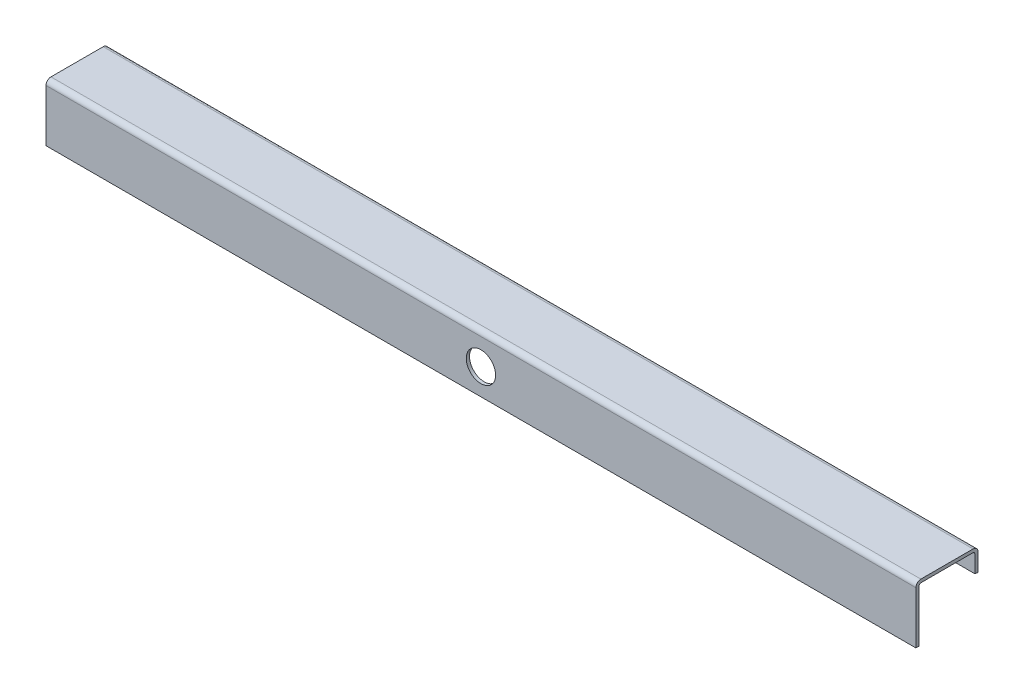
ISO-10303-21;
HEADER;
FILE_DESCRIPTION(('STEP AP214'),'2;1');
FILE_NAME('part.step','',(''),(''),'','','');
FILE_SCHEMA(('AUTOMOTIVE_DESIGN { 1 0 10303 214 1 1 1 1 }'));
ENDSEC;
DATA;
#1=APPLICATION_CONTEXT('core data for automotive mechanical design processes');
#2=APPLICATION_PROTOCOL_DEFINITION('international standard','automotive_design',2000,#1);
#3=PRODUCT_CONTEXT('',#1,'mechanical');
#4=PRODUCT('Part','Part','',(#3));
#5=PRODUCT_RELATED_PRODUCT_CATEGORY('part','',(#4));
#6=PRODUCT_DEFINITION_FORMATION('','',#4);
#7=PRODUCT_DEFINITION_CONTEXT('part definition',#1,'design');
#8=PRODUCT_DEFINITION('design','',#6,#7);
#9=PRODUCT_DEFINITION_SHAPE('','',#8);
#10=(LENGTH_UNIT() NAMED_UNIT(*) SI_UNIT(.MILLI.,.METRE.));
#11=(NAMED_UNIT(*) PLANE_ANGLE_UNIT() SI_UNIT($,.RADIAN.));
#12=(NAMED_UNIT(*) SI_UNIT($,.STERADIAN.) SOLID_ANGLE_UNIT());
#13=UNCERTAINTY_MEASURE_WITH_UNIT(LENGTH_MEASURE(1.E-05),#10,'distance_accuracy_value','');
#14=(GEOMETRIC_REPRESENTATION_CONTEXT(3) GLOBAL_UNCERTAINTY_ASSIGNED_CONTEXT((#13)) GLOBAL_UNIT_ASSIGNED_CONTEXT((#10,
#11,#12)) REPRESENTATION_CONTEXT('',''));
#15=CARTESIAN_POINT('',(0.,0.,0.));
#16=DIRECTION('',(0.,0.,1.));
#17=DIRECTION('',(1.,0.,0.));
#18=AXIS2_PLACEMENT_3D('',#15,#16,#17);
#19=CARTESIAN_POINT('',(177.8,22.6100351903886,12.5324354084501));
#20=DIRECTION('',(0.,0.978147600733808,-0.207911690817749));
#21=DIRECTION('',(0.,0.207911690817749,0.978147600733808));
#22=AXIS2_PLACEMENT_3D('',#19,#20,#21);
#23=PLANE('',#22);
#24=DIRECTION('',(-1.,0.,0.));
#25=VECTOR('',#24,1.);
#26=CARTESIAN_POINT('',(177.8,22.6100351903886,12.5324354084501));
#27=LINE('',#26,#25);
#28=CARTESIAN_POINT('',(177.8,22.6100351903886,12.5324354084501));
#29=VERTEX_POINT('',#28);
#30=CARTESIAN_POINT('',(91.3118069619053,22.6100351903886,12.5324354084501));
#31=VERTEX_POINT('',#30);
#32=EDGE_CURVE('E159',#29,#31,#27,.T.);
#33=ORIENTED_EDGE('',*,*,#32,.T.);
#34=CARTESIAN_POINT('',(88.9,20.8258863237003,4.13867493043614));
#35=DIRECTION('',(0.,0.978147600733808,-0.207911690817749));
#36=DIRECTION('',(0.,0.207911690817749,0.978147600733808));
#37=AXIS2_PLACEMENT_3D('',#34,#35,#36);
#38=ELLIPSE('',#37,14.4292030342332,3.00000000000001);
#39=CARTESIAN_POINT('',(91.4095813942013,22.4696628370617,11.8720354084501));
#40=VERTEX_POINT('',#39);
#41=EDGE_CURVE('E62',#31,#40,#38,.T.);
#42=ORIENTED_EDGE('',*,*,#41,.T.);
#43=DIRECTION('',(-1.,0.,0.));
#44=VECTOR('',#43,1.);
#45=CARTESIAN_POINT('',(177.8,22.4696628370617,11.8720354084501));
#46=LINE('',#45,#44);
#47=CARTESIAN_POINT('',(177.8,22.4696628370617,11.8720354084501));
#48=VERTEX_POINT('',#47);
#49=EDGE_CURVE('E55',#48,#40,#46,.T.);
#50=ORIENTED_EDGE('',*,*,#49,.F.);
#51=DIRECTION('',(0.,-0.207911690817749,-0.978147600733808));
#52=VECTOR('',#51,1.);
#53=CARTESIAN_POINT('',(177.8,22.6100351903886,12.5324354084501));
#54=LINE('',#53,#52);
#55=EDGE_CURVE('E172',#29,#48,#54,.T.);
#56=ORIENTED_EDGE('',*,*,#55,.F.);
#57=EDGE_LOOP('',(#33,#42,#50,#56));
#58=FACE_BOUND('',#57,.T.);
#59=ADVANCED_FACE('F47',(#58),#23,.F.);
#60=CARTESIAN_POINT('',(86.3904186057987,22.4696628370617,11.8720354084501));
#61=VERTEX_POINT('',#60);
#62=CARTESIAN_POINT('',(0.,22.4696628370617,11.8720354084501));
#63=VERTEX_POINT('',#62);
#64=EDGE_CURVE('E165',#61,#63,#46,.T.);
#65=ORIENTED_EDGE('',*,*,#64,.F.);
#66=CARTESIAN_POINT('',(86.4881930380947,22.6100351903886,12.5324354084501));
#67=VERTEX_POINT('',#66);
#68=EDGE_CURVE('E149',#61,#67,#38,.T.);
#69=ORIENTED_EDGE('',*,*,#68,.T.);
#70=CARTESIAN_POINT('',(0.,22.6100351903886,12.5324354084501));
#71=VERTEX_POINT('',#70);
#72=EDGE_CURVE('E177',#67,#71,#27,.T.);
#73=ORIENTED_EDGE('',*,*,#72,.T.);
#74=DIRECTION('',(0.,-0.207911690817749,-0.978147600733808));
#75=VECTOR('',#74,1.);
#76=CARTESIAN_POINT('',(0.,22.6100351903886,12.5324354084501));
#77=LINE('',#76,#75);
#78=EDGE_CURVE('E170',#71,#63,#77,.T.);
#79=ORIENTED_EDGE('',*,*,#78,.T.);
#80=EDGE_LOOP('',(#65,#69,#73,#79));
#81=FACE_BOUND('',#80,.T.);
#82=ADVANCED_FACE('F249',(#81),#23,.F.);
#83=CARTESIAN_POINT('',(177.8,22.4696628370617,11.8720354084501));
#84=DIRECTION('',(0.,0.,1.));
#85=DIRECTION('',(1.,0.,0.));
#86=AXIS2_PLACEMENT_3D('',#83,#84,#85);
#87=PLANE('',#86);
#88=ORIENTED_EDGE('',*,*,#49,.T.);
#89=CARTESIAN_POINT('',(88.9,20.8258863237003,11.8720354084501));
#90=DIRECTION('',(0.,0.,1.));
#91=DIRECTION('',(1.,0.,0.));
#92=AXIS2_PLACEMENT_3D('',#89,#90,#91);
#93=CIRCLE('',#92,3.00000000000001);
#94=EDGE_CURVE('E146',#40,#61,#93,.T.);
#95=ORIENTED_EDGE('',*,*,#94,.T.);
#96=ORIENTED_EDGE('',*,*,#64,.T.);
#97=DIRECTION('',(0.,1.,0.));
#98=VECTOR('',#97,1.);
#99=CARTESIAN_POINT('',(0.,22.4696628370617,11.8720354084501));
#100=LINE('',#99,#98);
#101=CARTESIAN_POINT('',(0.,26.1598863237003,11.8720354084501));
#102=VERTEX_POINT('',#101);
#103=EDGE_CURVE('E178',#63,#102,#100,.T.);
#104=ORIENTED_EDGE('',*,*,#103,.T.);
#105=DIRECTION('',(-1.,0.,0.));
#106=VECTOR('',#105,1.);
#107=CARTESIAN_POINT('',(177.8,26.1598863237003,11.8720354084501));
#108=LINE('',#107,#106);
#109=CARTESIAN_POINT('',(177.8,26.1598863237003,11.8720354084501));
#110=VERTEX_POINT('',#109);
#111=EDGE_CURVE('E167',#110,#102,#108,.T.);
#112=ORIENTED_EDGE('',*,*,#111,.F.);
#113=DIRECTION('',(0.,1.,0.));
#114=VECTOR('',#113,1.);
#115=CARTESIAN_POINT('',(177.8,22.4696628370617,11.8720354084501));
#116=LINE('',#115,#114);
#117=EDGE_CURVE('E164',#48,#110,#116,.T.);
#118=ORIENTED_EDGE('',*,*,#117,.F.);
#119=EDGE_LOOP('',(#88,#95,#96,#104,#112,#118));
#120=FACE_BOUND('',#119,.T.);
#121=ADVANCED_FACE('F162',(#120),#87,.F.);
#122=CARTESIAN_POINT('',(177.8,26.1598863237003,12.8880354084501));
#123=DIRECTION('',(-1.,0.,0.));
#124=DIRECTION('',(0.,0.,1.));
#125=AXIS2_PLACEMENT_3D('',#122,#123,#124);
#126=CYLINDRICAL_SURFACE('',#125,1.016);
#127=CARTESIAN_POINT('',(0.,26.1598863237003,12.8880354084501));
#128=DIRECTION('',(1.,0.,0.));
#129=DIRECTION('',(0.,0.,-1.));
#130=AXIS2_PLACEMENT_3D('',#127,#128,#129);
#131=CIRCLE('',#130,1.016);
#132=CARTESIAN_POINT('',(0.,27.1758863237003,12.8880354084501));
#133=VERTEX_POINT('',#132);
#134=EDGE_CURVE('E180',#102,#133,#131,.T.);
#135=ORIENTED_EDGE('',*,*,#134,.T.);
#136=DIRECTION('',(-1.,0.,0.));
#137=VECTOR('',#136,1.);
#138=CARTESIAN_POINT('',(177.8,27.1758863237003,12.8880354084501));
#139=LINE('',#138,#137);
#140=CARTESIAN_POINT('',(177.8,27.1758863237003,12.8880354084501));
#141=VERTEX_POINT('',#140);
#142=EDGE_CURVE('E183',#141,#133,#139,.T.);
#143=ORIENTED_EDGE('',*,*,#142,.F.);
#144=CARTESIAN_POINT('',(177.8,26.1598863237003,12.8880354084501));
#145=DIRECTION('',(1.,0.,0.));
#146=DIRECTION('',(0.,0.,-1.));
#147=AXIS2_PLACEMENT_3D('',#144,#145,#146);
#148=CIRCLE('',#147,1.016);
#149=EDGE_CURVE('E185',#110,#141,#148,.T.);
#150=ORIENTED_EDGE('',*,*,#149,.F.);
#151=ORIENTED_EDGE('',*,*,#111,.T.);
#152=EDGE_LOOP('',(#135,#143,#150,#151));
#153=FACE_BOUND('',#152,.T.);
#154=ADVANCED_FACE('F308',(#153),#126,.T.);
#155=CARTESIAN_POINT('',(177.8,27.1758863237003,12.8880354084501));
#156=DIRECTION('',(0.,-1.,0.));
#157=DIRECTION('',(0.,0.,-1.));
#158=AXIS2_PLACEMENT_3D('',#155,#156,#157);
#159=PLANE('',#158);
#160=DIRECTION('',(0.,0.,1.));
#161=VECTOR('',#160,1.);
#162=CARTESIAN_POINT('',(0.,27.1758863237003,12.8880354084501));
#163=LINE('',#162,#161);
#164=CARTESIAN_POINT('',(0.,27.1758863237003,23.5560354084501));
#165=VERTEX_POINT('',#164);
#166=EDGE_CURVE('E187',#133,#165,#163,.T.);
#167=ORIENTED_EDGE('',*,*,#166,.T.);
#168=DIRECTION('',(-1.,0.,0.));
#169=VECTOR('',#168,1.);
#170=CARTESIAN_POINT('',(177.8,27.1758863237003,23.5560354084501));
#171=LINE('',#170,#169);
#172=CARTESIAN_POINT('',(177.8,27.1758863237003,23.5560354084501));
#173=VERTEX_POINT('',#172);
#174=EDGE_CURVE('E190',#173,#165,#171,.T.);
#175=ORIENTED_EDGE('',*,*,#174,.F.);
#176=DIRECTION('',(0.,0.,1.));
#177=VECTOR('',#176,1.);
#178=CARTESIAN_POINT('',(177.8,27.1758863237003,12.8880354084501));
#179=LINE('',#178,#177);
#180=EDGE_CURVE('E192',#141,#173,#179,.T.);
#181=ORIENTED_EDGE('',*,*,#180,.F.);
#182=ORIENTED_EDGE('',*,*,#142,.T.);
#183=EDGE_LOOP('',(#167,#175,#181,#182));
#184=FACE_BOUND('',#183,.T.);
#185=ADVANCED_FACE('F304',(#184),#159,.F.);
#186=CARTESIAN_POINT('',(177.8,26.1598863237003,23.5560354084501));
#187=DIRECTION('',(-1.,0.,0.));
#188=DIRECTION('',(0.,0.,1.));
#189=AXIS2_PLACEMENT_3D('',#186,#187,#188);
#190=CYLINDRICAL_SURFACE('',#189,1.016);
#191=CARTESIAN_POINT('',(0.,26.1598863237003,23.5560354084501));
#192=DIRECTION('',(1.,0.,0.));
#193=DIRECTION('',(0.,0.,-1.));
#194=AXIS2_PLACEMENT_3D('',#191,#192,#193);
#195=CIRCLE('',#194,1.01599999999999);
#196=CARTESIAN_POINT('',(0.,26.1598863237003,24.5720354084501));
#197=VERTEX_POINT('',#196);
#198=EDGE_CURVE('E194',#165,#197,#195,.T.);
#199=ORIENTED_EDGE('',*,*,#198,.T.);
#200=DIRECTION('',(-1.,0.,0.));
#201=VECTOR('',#200,1.);
#202=CARTESIAN_POINT('',(177.8,26.1598863237003,24.5720354084501));
#203=LINE('',#202,#201);
#204=CARTESIAN_POINT('',(177.8,26.1598863237003,24.5720354084501));
#205=VERTEX_POINT('',#204);
#206=EDGE_CURVE('E197',#205,#197,#203,.T.);
#207=ORIENTED_EDGE('',*,*,#206,.F.);
#208=CARTESIAN_POINT('',(177.8,26.1598863237003,23.5560354084501));
#209=DIRECTION('',(1.,0.,0.));
#210=DIRECTION('',(0.,0.,-1.));
#211=AXIS2_PLACEMENT_3D('',#208,#209,#210);
#212=CIRCLE('',#211,1.01599999999999);
#213=EDGE_CURVE('E199',#173,#205,#212,.T.);
#214=ORIENTED_EDGE('',*,*,#213,.F.);
#215=ORIENTED_EDGE('',*,*,#174,.T.);
#216=EDGE_LOOP('',(#199,#207,#214,#215));
#217=FACE_BOUND('',#216,.T.);
#218=ADVANCED_FACE('F273',(#217),#190,.T.);
#219=CARTESIAN_POINT('',(177.8,26.1598863237003,24.5720354084501));
#220=DIRECTION('',(0.,0.,-1.));
#221=DIRECTION('',(0.,1.,0.));
#222=AXIS2_PLACEMENT_3D('',#219,#220,#221);
#223=PLANE('',#222);
#224=CARTESIAN_POINT('',(88.9,20.8258863237003,24.5720354084501));
#225=DIRECTION('',(0.,0.,1.));
#226=DIRECTION('',(1.,0.,0.));
#227=AXIS2_PLACEMENT_3D('',#224,#225,#226);
#228=CIRCLE('',#227,3.00000000000001);
#229=CARTESIAN_POINT('',(91.9,20.8258863237003,24.5720354084501));
#230=VERTEX_POINT('',#229);
#231=EDGE_CURVE('E153',#230,#230,#228,.T.);
#232=ORIENTED_EDGE('',*,*,#231,.F.);
#233=EDGE_LOOP('',(#232));
#234=FACE_BOUND('',#233,.T.);
#235=DIRECTION('',(0.,-1.,0.));
#236=VECTOR('',#235,1.);
#237=CARTESIAN_POINT('',(0.,26.1598863237003,24.5720354084501));
#238=LINE('',#237,#236);
#239=CARTESIAN_POINT('',(0.,15.4918863237003,24.5720354084501));
#240=VERTEX_POINT('',#239);
#241=EDGE_CURVE('E201',#197,#240,#238,.T.);
#242=ORIENTED_EDGE('',*,*,#241,.T.);
#243=DIRECTION('',(-1.,0.,0.));
#244=VECTOR('',#243,1.);
#245=CARTESIAN_POINT('',(177.8,15.4918863237003,24.5720354084501));
#246=LINE('',#245,#244);
#247=CARTESIAN_POINT('',(177.8,15.4918863237003,24.5720354084501));
#248=VERTEX_POINT('',#247);
#249=EDGE_CURVE('E204',#248,#240,#246,.T.);
#250=ORIENTED_EDGE('',*,*,#249,.F.);
#251=DIRECTION('',(0.,-1.,0.));
#252=VECTOR('',#251,1.);
#253=CARTESIAN_POINT('',(177.8,26.1598863237003,24.5720354084501));
#254=LINE('',#253,#252);
#255=EDGE_CURVE('E206',#205,#248,#254,.T.);
#256=ORIENTED_EDGE('',*,*,#255,.F.);
#257=ORIENTED_EDGE('',*,*,#206,.T.);
#258=EDGE_LOOP('',(#242,#250,#256,#257));
#259=FACE_BOUND('',#258,.T.);
#260=ADVANCED_FACE('F269',(#234,#259),#223,.F.);
#261=CARTESIAN_POINT('',(177.8,15.4918863237003,24.5720354084501));
#262=DIRECTION('',(0.,1.,0.));
#263=DIRECTION('',(0.,0.,1.));
#264=AXIS2_PLACEMENT_3D('',#261,#262,#263);
#265=PLANE('',#264);
#266=DIRECTION('',(0.,0.,-1.));
#267=VECTOR('',#266,1.);
#268=CARTESIAN_POINT('',(0.,15.4918863237003,24.5720354084501));
#269=LINE('',#268,#267);
#270=CARTESIAN_POINT('',(0.,15.4918863237003,23.9116354084501));
#271=VERTEX_POINT('',#270);
#272=EDGE_CURVE('E208',#240,#271,#269,.T.);
#273=ORIENTED_EDGE('',*,*,#272,.T.);
#274=DIRECTION('',(-1.,0.,0.));
#275=VECTOR('',#274,1.);
#276=CARTESIAN_POINT('',(177.8,15.4918863237003,23.9116354084501));
#277=LINE('',#276,#275);
#278=CARTESIAN_POINT('',(177.8,15.4918863237003,23.9116354084501));
#279=VERTEX_POINT('',#278);
#280=EDGE_CURVE('E211',#279,#271,#277,.T.);
#281=ORIENTED_EDGE('',*,*,#280,.F.);
#282=DIRECTION('',(0.,0.,-1.));
#283=VECTOR('',#282,1.);
#284=CARTESIAN_POINT('',(177.8,15.4918863237003,24.5720354084501));
#285=LINE('',#284,#283);
#286=EDGE_CURVE('E213',#248,#279,#285,.T.);
#287=ORIENTED_EDGE('',*,*,#286,.F.);
#288=ORIENTED_EDGE('',*,*,#249,.T.);
#289=EDGE_LOOP('',(#273,#281,#287,#288));
#290=FACE_BOUND('',#289,.T.);
#291=ADVANCED_FACE('F272',(#290),#265,.F.);
#292=CARTESIAN_POINT('',(177.8,26.1598863237003,23.9116354084501));
#293=DIRECTION('',(0.,0.,1.));
#294=DIRECTION('',(1.,0.,0.));
#295=AXIS2_PLACEMENT_3D('',#292,#293,#294);
#296=PLANE('',#295);
#297=CARTESIAN_POINT('',(88.9,20.8258863237003,23.9116354084501));
#298=DIRECTION('',(0.,0.,1.));
#299=DIRECTION('',(1.,0.,0.));
#300=AXIS2_PLACEMENT_3D('',#297,#298,#299);
#301=CIRCLE('',#300,3.00000000000001);
#302=CARTESIAN_POINT('',(91.9,20.8258863237003,23.9116354084501));
#303=VERTEX_POINT('',#302);
#304=EDGE_CURVE('E160',#303,#303,#301,.T.);
#305=ORIENTED_EDGE('',*,*,#304,.T.);
#306=EDGE_LOOP('',(#305));
#307=FACE_BOUND('',#306,.T.);
#308=DIRECTION('',(0.,1.,0.));
#309=VECTOR('',#308,1.);
#310=CARTESIAN_POINT('',(0.,26.1598863237003,23.9116354084501));
#311=LINE('',#310,#309);
#312=CARTESIAN_POINT('',(0.,26.1598863237003,23.9116354084501));
#313=VERTEX_POINT('',#312);
#314=EDGE_CURVE('E215',#271,#313,#311,.T.);
#315=ORIENTED_EDGE('',*,*,#314,.T.);
#316=DIRECTION('',(-1.,0.,0.));
#317=VECTOR('',#316,1.);
#318=CARTESIAN_POINT('',(177.8,26.1598863237003,23.9116354084501));
#319=LINE('',#318,#317);
#320=CARTESIAN_POINT('',(177.8,26.1598863237003,23.9116354084501));
#321=VERTEX_POINT('',#320);
#322=EDGE_CURVE('E218',#321,#313,#319,.T.);
#323=ORIENTED_EDGE('',*,*,#322,.F.);
#324=DIRECTION('',(0.,1.,0.));
#325=VECTOR('',#324,1.);
#326=CARTESIAN_POINT('',(177.8,26.1598863237003,23.9116354084501));
#327=LINE('',#326,#325);
#328=EDGE_CURVE('E220',#279,#321,#327,.T.);
#329=ORIENTED_EDGE('',*,*,#328,.F.);
#330=ORIENTED_EDGE('',*,*,#280,.T.);
#331=EDGE_LOOP('',(#315,#323,#329,#330));
#332=FACE_BOUND('',#331,.T.);
#333=ADVANCED_FACE('F289',(#307,#332),#296,.F.);
#334=CARTESIAN_POINT('',(177.8,26.1598863237003,23.5560354084501));
#335=DIRECTION('',(-1.,0.,0.));
#336=DIRECTION('',(0.,0.,1.));
#337=AXIS2_PLACEMENT_3D('',#334,#335,#336);
#338=CYLINDRICAL_SURFACE('',#337,0.355600000000003);
#339=CARTESIAN_POINT('',(0.,26.1598863237003,23.5560354084501));
#340=DIRECTION('',(-1.,0.,0.));
#341=DIRECTION('',(0.,0.,1.));
#342=AXIS2_PLACEMENT_3D('',#339,#340,#341);
#343=CIRCLE('',#342,0.355600000000003);
#344=CARTESIAN_POINT('',(0.,26.5154863237003,23.5560354084501));
#345=VERTEX_POINT('',#344);
#346=EDGE_CURVE('E222',#313,#345,#343,.T.);
#347=ORIENTED_EDGE('',*,*,#346,.T.);
#348=DIRECTION('',(-1.,0.,0.));
#349=VECTOR('',#348,1.);
#350=CARTESIAN_POINT('',(177.8,26.5154863237003,23.5560354084501));
#351=LINE('',#350,#349);
#352=CARTESIAN_POINT('',(177.8,26.5154863237003,23.5560354084501));
#353=VERTEX_POINT('',#352);
#354=EDGE_CURVE('E225',#353,#345,#351,.T.);
#355=ORIENTED_EDGE('',*,*,#354,.F.);
#356=CARTESIAN_POINT('',(177.8,26.1598863237003,23.5560354084501));
#357=DIRECTION('',(-1.,1.33244463861568E-13,1.3324446386157E-13));
#358=DIRECTION('',(1.3324446386157E-13,0.,1.));
#359=AXIS2_PLACEMENT_3D('',#356,#357,#358);
#360=CIRCLE('',#359,0.355600000000003);
#361=EDGE_CURVE('E227',#321,#353,#360,.T.);
#362=ORIENTED_EDGE('',*,*,#361,.F.);
#363=ORIENTED_EDGE('',*,*,#322,.T.);
#364=EDGE_LOOP('',(#347,#355,#362,#363));
#365=FACE_BOUND('',#364,.T.);
#366=ADVANCED_FACE('F293',(#365),#338,.F.);
#367=CARTESIAN_POINT('',(177.8,26.5154863237003,12.8880354084501));
#368=DIRECTION('',(0.,1.,0.));
#369=DIRECTION('',(0.,0.,1.));
#370=AXIS2_PLACEMENT_3D('',#367,#368,#369);
#371=PLANE('',#370);
#372=DIRECTION('',(0.,0.,-1.));
#373=VECTOR('',#372,1.);
#374=CARTESIAN_POINT('',(0.,26.5154863237003,12.8880354084501));
#375=LINE('',#374,#373);
#376=CARTESIAN_POINT('',(0.,26.5154863237003,12.8880354084501));
#377=VERTEX_POINT('',#376);
#378=EDGE_CURVE('E229',#345,#377,#375,.T.);
#379=ORIENTED_EDGE('',*,*,#378,.T.);
#380=DIRECTION('',(-1.,0.,0.));
#381=VECTOR('',#380,1.);
#382=CARTESIAN_POINT('',(177.8,26.5154863237003,12.8880354084501));
#383=LINE('',#382,#381);
#384=CARTESIAN_POINT('',(177.8,26.5154863237003,12.8880354084501));
#385=VERTEX_POINT('',#384);
#386=EDGE_CURVE('E232',#385,#377,#383,.T.);
#387=ORIENTED_EDGE('',*,*,#386,.F.);
#388=DIRECTION('',(0.,0.,-1.));
#389=VECTOR('',#388,1.);
#390=CARTESIAN_POINT('',(177.8,26.5154863237003,12.8880354084501));
#391=LINE('',#390,#389);
#392=EDGE_CURVE('E234',#353,#385,#391,.T.);
#393=ORIENTED_EDGE('',*,*,#392,.F.);
#394=ORIENTED_EDGE('',*,*,#354,.T.);
#395=EDGE_LOOP('',(#379,#387,#393,#394));
#396=FACE_BOUND('',#395,.T.);
#397=ADVANCED_FACE('F339',(#396),#371,.F.);
#398=CARTESIAN_POINT('',(177.8,26.1598863237003,12.8880354084501));
#399=DIRECTION('',(-1.,0.,0.));
#400=DIRECTION('',(0.,0.,1.));
#401=AXIS2_PLACEMENT_3D('',#398,#399,#400);
#402=CYLINDRICAL_SURFACE('',#401,0.3556);
#403=CARTESIAN_POINT('',(0.,26.1598863237003,12.8880354084501));
#404=DIRECTION('',(-1.,0.,0.));
#405=DIRECTION('',(0.,0.,1.));
#406=AXIS2_PLACEMENT_3D('',#403,#404,#405);
#407=CIRCLE('',#406,0.355600000000001);
#408=CARTESIAN_POINT('',(0.,26.1598863237003,12.5324354084501));
#409=VERTEX_POINT('',#408);
#410=EDGE_CURVE('E236',#377,#409,#407,.T.);
#411=ORIENTED_EDGE('',*,*,#410,.T.);
#412=DIRECTION('',(-1.,0.,0.));
#413=VECTOR('',#412,1.);
#414=CARTESIAN_POINT('',(177.8,26.1598863237003,12.5324354084501));
#415=LINE('',#414,#413);
#416=CARTESIAN_POINT('',(177.8,26.1598863237003,12.5324354084501));
#417=VERTEX_POINT('',#416);
#418=EDGE_CURVE('E176',#417,#409,#415,.T.);
#419=ORIENTED_EDGE('',*,*,#418,.F.);
#420=CARTESIAN_POINT('',(177.8,26.1598863237003,12.8880354084501));
#421=DIRECTION('',(-1.,0.,0.));
#422=DIRECTION('',(0.,0.,1.));
#423=AXIS2_PLACEMENT_3D('',#420,#421,#422);
#424=CIRCLE('',#423,0.355600000000001);
#425=EDGE_CURVE('E240',#385,#417,#424,.T.);
#426=ORIENTED_EDGE('',*,*,#425,.F.);
#427=ORIENTED_EDGE('',*,*,#386,.T.);
#428=EDGE_LOOP('',(#411,#419,#426,#427));
#429=FACE_BOUND('',#428,.T.);
#430=ADVANCED_FACE('F334',(#429),#402,.F.);
#431=CARTESIAN_POINT('',(177.8,22.6100351903886,12.5324354084501));
#432=DIRECTION('',(0.,0.,-1.));
#433=DIRECTION('',(0.,1.,0.));
#434=AXIS2_PLACEMENT_3D('',#431,#432,#433);
#435=PLANE('',#434);
#436=ORIENTED_EDGE('',*,*,#72,.F.);
#437=CARTESIAN_POINT('',(88.9,20.8258863237003,12.5324354084501));
#438=DIRECTION('',(0.,0.,-1.));
#439=DIRECTION('',(0.,1.,0.));
#440=AXIS2_PLACEMENT_3D('',#437,#438,#439);
#441=CIRCLE('',#440,3.00000000000001);
#442=EDGE_CURVE('E11',#67,#31,#441,.T.);
#443=ORIENTED_EDGE('',*,*,#442,.T.);
#444=ORIENTED_EDGE('',*,*,#32,.F.);
#445=DIRECTION('',(0.,-1.,0.));
#446=VECTOR('',#445,1.);
#447=CARTESIAN_POINT('',(177.8,22.6100351903886,12.5324354084501));
#448=LINE('',#447,#446);
#449=EDGE_CURVE('E69',#417,#29,#448,.T.);
#450=ORIENTED_EDGE('',*,*,#449,.F.);
#451=ORIENTED_EDGE('',*,*,#418,.T.);
#452=DIRECTION('',(0.,-1.,0.));
#453=VECTOR('',#452,1.);
#454=CARTESIAN_POINT('',(0.,22.6100351903886,12.5324354084501));
#455=LINE('',#454,#453);
#456=EDGE_CURVE('E174',#409,#71,#455,.T.);
#457=ORIENTED_EDGE('',*,*,#456,.T.);
#458=EDGE_LOOP('',(#436,#443,#444,#450,#451,#457));
#459=FACE_BOUND('',#458,.T.);
#460=ADVANCED_FACE('F253',(#459),#435,.F.);
#461=CARTESIAN_POINT('',(177.8,26.1598863237003,12.8880354084501));
#462=DIRECTION('',(1.,0.,0.));
#463=DIRECTION('',(0.,0.,-1.));
#464=AXIS2_PLACEMENT_3D('',#461,#462,#463);
#465=PLANE('',#464);
#466=ORIENTED_EDGE('',*,*,#55,.T.);
#467=ORIENTED_EDGE('',*,*,#117,.T.);
#468=ORIENTED_EDGE('',*,*,#149,.T.);
#469=ORIENTED_EDGE('',*,*,#180,.T.);
#470=ORIENTED_EDGE('',*,*,#213,.T.);
#471=ORIENTED_EDGE('',*,*,#255,.T.);
#472=ORIENTED_EDGE('',*,*,#286,.T.);
#473=ORIENTED_EDGE('',*,*,#328,.T.);
#474=ORIENTED_EDGE('',*,*,#361,.T.);
#475=ORIENTED_EDGE('',*,*,#392,.T.);
#476=ORIENTED_EDGE('',*,*,#425,.T.);
#477=ORIENTED_EDGE('',*,*,#449,.T.);
#478=EDGE_LOOP('',(#466,#467,#468,#469,#470,#471,#472,#473,#474,#475,#476,#477));
#479=FACE_BOUND('',#478,.T.);
#480=ADVANCED_FACE('F296',(#479),#465,.T.);
#481=CARTESIAN_POINT('',(0.,26.1598863237003,12.8880354084501));
#482=DIRECTION('',(1.,0.,0.));
#483=DIRECTION('',(0.,0.,-1.));
#484=AXIS2_PLACEMENT_3D('',#481,#482,#483);
#485=PLANE('',#484);
#486=ORIENTED_EDGE('',*,*,#78,.F.);
#487=ORIENTED_EDGE('',*,*,#456,.F.);
#488=ORIENTED_EDGE('',*,*,#410,.F.);
#489=ORIENTED_EDGE('',*,*,#378,.F.);
#490=ORIENTED_EDGE('',*,*,#346,.F.);
#491=ORIENTED_EDGE('',*,*,#314,.F.);
#492=ORIENTED_EDGE('',*,*,#272,.F.);
#493=ORIENTED_EDGE('',*,*,#241,.F.);
#494=ORIENTED_EDGE('',*,*,#198,.F.);
#495=ORIENTED_EDGE('',*,*,#166,.F.);
#496=ORIENTED_EDGE('',*,*,#134,.F.);
#497=ORIENTED_EDGE('',*,*,#103,.F.);
#498=EDGE_LOOP('',(#486,#487,#488,#489,#490,#491,#492,#493,#494,#495,#496,#497));
#499=FACE_BOUND('',#498,.T.);
#500=ADVANCED_FACE('F49',(#499),#485,.F.);
#501=CARTESIAN_POINT('',(88.9,20.8258863237003,11.8720354084501));
#502=DIRECTION('',(0.,0.,1.));
#503=DIRECTION('',(1.,0.,0.));
#504=AXIS2_PLACEMENT_3D('',#501,#502,#503);
#505=CYLINDRICAL_SURFACE('',#504,3.00000000000001);
#506=ORIENTED_EDGE('',*,*,#442,.F.);
#507=ORIENTED_EDGE('',*,*,#68,.F.);
#508=ORIENTED_EDGE('',*,*,#94,.F.);
#509=ORIENTED_EDGE('',*,*,#41,.F.);
#510=EDGE_LOOP('',(#506,#507,#508,#509));
#511=FACE_BOUND('',#510,.T.);
#512=ADVANCED_FACE('F147',(#511),#505,.F.);
#513=ORIENTED_EDGE('',*,*,#231,.T.);
#514=EDGE_LOOP('',(#513));
#515=FACE_BOUND('',#514,.T.);
#516=ORIENTED_EDGE('',*,*,#304,.F.);
#517=EDGE_LOOP('',(#516));
#518=FACE_BOUND('',#517,.T.);
#519=ADVANCED_FACE('F266',(#515,#518),#505,.F.);
#520=CLOSED_SHELL('',(#59,#82,#121,#154,#185,#218,#260,#291,#333,#366,#397,#430,#460,#480,#500,
#512,#519));
#521=MANIFOLD_SOLID_BREP('B2',#520);
#522=ADVANCED_BREP_SHAPE_REPRESENTATION('',(#18,#521),#14);
#523=SHAPE_DEFINITION_REPRESENTATION(#9,#522);
ENDSEC;
END-ISO-10303-21;
